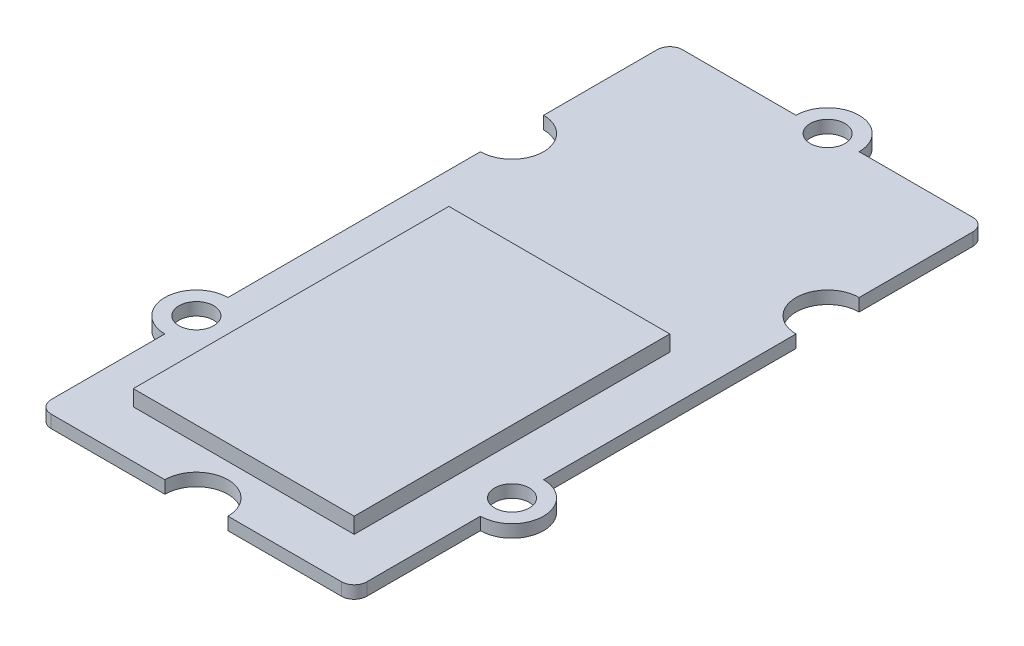
ISO-10303-21;
HEADER;
FILE_DESCRIPTION(('STEP AP214'),'2;1');
FILE_NAME('part.step','',(''),(''),'','','');
FILE_SCHEMA(('AUTOMOTIVE_DESIGN { 1 0 10303 214 1 1 1 1 }'));
ENDSEC;
DATA;
#1=APPLICATION_CONTEXT('core data for automotive mechanical design processes');
#2=APPLICATION_PROTOCOL_DEFINITION('international standard','automotive_design',2000,#1);
#3=PRODUCT_CONTEXT('',#1,'mechanical');
#4=PRODUCT('Part','Part','',(#3));
#5=PRODUCT_RELATED_PRODUCT_CATEGORY('part','',(#4));
#6=PRODUCT_DEFINITION_FORMATION('','',#4);
#7=PRODUCT_DEFINITION_CONTEXT('part definition',#1,'design');
#8=PRODUCT_DEFINITION('design','',#6,#7);
#9=PRODUCT_DEFINITION_SHAPE('','',#8);
#10=(LENGTH_UNIT() NAMED_UNIT(*) SI_UNIT(.MILLI.,.METRE.));
#11=(NAMED_UNIT(*) PLANE_ANGLE_UNIT() SI_UNIT($,.RADIAN.));
#12=(NAMED_UNIT(*) SI_UNIT($,.STERADIAN.) SOLID_ANGLE_UNIT());
#13=UNCERTAINTY_MEASURE_WITH_UNIT(LENGTH_MEASURE(1.E-05),#10,'distance_accuracy_value','');
#14=(GEOMETRIC_REPRESENTATION_CONTEXT(3) GLOBAL_UNCERTAINTY_ASSIGNED_CONTEXT((#13)) GLOBAL_UNIT_ASSIGNED_CONTEXT((#10,
#11,#12)) REPRESENTATION_CONTEXT('',''));
#15=CARTESIAN_POINT('',(0.,0.,0.));
#16=DIRECTION('',(0.,0.,1.));
#17=DIRECTION('',(1.,0.,0.));
#18=AXIS2_PLACEMENT_3D('',#15,#16,#17);
#19=CARTESIAN_POINT('',(0.8,0.8,-0.8));
#20=DIRECTION('',(0.,-1.,0.));
#21=DIRECTION('',(0.,0.,-1.));
#22=AXIS2_PLACEMENT_3D('',#19,#20,#21);
#23=PLANE('',#22);
#24=CARTESIAN_POINT('',(0.,0.8,-10.));
#25=DIRECTION('',(0.,1.,0.));
#26=DIRECTION('',(0.,0.,1.));
#27=AXIS2_PLACEMENT_3D('',#24,#25,#26);
#28=CIRCLE('',#27,1.1);
#29=CARTESIAN_POINT('',(0.,0.8,-8.9));
#30=VERTEX_POINT('',#29);
#31=EDGE_CURVE('E216',#30,#30,#28,.T.);
#32=ORIENTED_EDGE('',*,*,#31,.F.);
#33=EDGE_LOOP('',(#32));
#34=FACE_BOUND('',#33,.T.);
#35=CARTESIAN_POINT('',(20.,0.8,-10.));
#36=DIRECTION('',(0.,1.,0.));
#37=DIRECTION('',(0.,0.,1.));
#38=AXIS2_PLACEMENT_3D('',#35,#36,#37);
#39=CIRCLE('',#38,1.1);
#40=CARTESIAN_POINT('',(20.,0.8,-8.9));
#41=VERTEX_POINT('',#40);
#42=EDGE_CURVE('E225',#41,#41,#39,.T.);
#43=ORIENTED_EDGE('',*,*,#42,.F.);
#44=EDGE_LOOP('',(#43));
#45=FACE_BOUND('',#44,.T.);
#46=CARTESIAN_POINT('',(10.,0.8,-40.));
#47=DIRECTION('',(0.,1.,0.));
#48=DIRECTION('',(0.,0.,1.));
#49=AXIS2_PLACEMENT_3D('',#46,#47,#48);
#50=CIRCLE('',#49,1.1);
#51=CARTESIAN_POINT('',(10.,0.8,-38.9));
#52=VERTEX_POINT('',#51);
#53=EDGE_CURVE('E231',#52,#52,#50,.T.);
#54=ORIENTED_EDGE('',*,*,#53,.F.);
#55=EDGE_LOOP('',(#54));
#56=FACE_BOUND('',#55,.T.);
#57=CARTESIAN_POINT('',(0.8,0.8,-0.8));
#58=DIRECTION('',(0.,1.,0.));
#59=DIRECTION('',(0.,0.,-1.));
#60=AXIS2_PLACEMENT_3D('',#57,#58,#59);
#61=CIRCLE('',#60,0.8);
#62=CARTESIAN_POINT('',(0.,0.8,-0.800000000000006));
#63=VERTEX_POINT('',#62);
#64=CARTESIAN_POINT('',(0.800000000000006,0.8,0.));
#65=VERTEX_POINT('',#64);
#66=EDGE_CURVE('E237',#63,#65,#61,.T.);
#67=ORIENTED_EDGE('',*,*,#66,.T.);
#68=DIRECTION('',(1.,0.,0.));
#69=VECTOR('',#68,1.);
#70=CARTESIAN_POINT('',(0.800000000000006,0.8,0.));
#71=LINE('',#70,#69);
#72=CARTESIAN_POINT('',(8.,0.8,0.));
#73=VERTEX_POINT('',#72);
#74=EDGE_CURVE('E240',#65,#73,#71,.T.);
#75=ORIENTED_EDGE('',*,*,#74,.T.);
#76=CARTESIAN_POINT('',(10.,0.8,0.));
#77=DIRECTION('',(0.,-1.,0.));
#78=DIRECTION('',(0.,0.,1.));
#79=AXIS2_PLACEMENT_3D('',#76,#77,#78);
#80=CIRCLE('',#79,2.);
#81=CARTESIAN_POINT('',(12.,0.8,0.));
#82=VERTEX_POINT('',#81);
#83=EDGE_CURVE('E243',#73,#82,#80,.T.);
#84=ORIENTED_EDGE('',*,*,#83,.T.);
#85=DIRECTION('',(1.,0.,0.));
#86=VECTOR('',#85,1.);
#87=CARTESIAN_POINT('',(12.,0.8,0.));
#88=LINE('',#87,#86);
#89=CARTESIAN_POINT('',(19.2,0.8,0.));
#90=VERTEX_POINT('',#89);
#91=EDGE_CURVE('E245',#82,#90,#88,.T.);
#92=ORIENTED_EDGE('',*,*,#91,.T.);
#93=CARTESIAN_POINT('',(19.2,0.8,-0.8));
#94=DIRECTION('',(0.,1.,0.));
#95=DIRECTION('',(0.,0.,1.));
#96=AXIS2_PLACEMENT_3D('',#93,#94,#95);
#97=CIRCLE('',#96,0.799999999999999);
#98=CARTESIAN_POINT('',(20.,0.8,-0.800000000000006));
#99=VERTEX_POINT('',#98);
#100=EDGE_CURVE('E247',#90,#99,#97,.T.);
#101=ORIENTED_EDGE('',*,*,#100,.T.);
#102=DIRECTION('',(0.,0.,-1.));
#103=VECTOR('',#102,1.);
#104=CARTESIAN_POINT('',(20.,0.8,-0.800000000000006));
#105=LINE('',#104,#103);
#106=CARTESIAN_POINT('',(20.,0.8,-8.));
#107=VERTEX_POINT('',#106);
#108=EDGE_CURVE('E249',#99,#107,#105,.T.);
#109=ORIENTED_EDGE('',*,*,#108,.T.);
#110=CARTESIAN_POINT('',(20.,0.8,-10.));
#111=DIRECTION('',(0.,1.,0.));
#112=DIRECTION('',(0.,0.,1.));
#113=AXIS2_PLACEMENT_3D('',#110,#111,#112);
#114=CIRCLE('',#113,2.);
#115=CARTESIAN_POINT('',(20.,0.8,-12.));
#116=VERTEX_POINT('',#115);
#117=EDGE_CURVE('E251',#107,#116,#114,.T.);
#118=ORIENTED_EDGE('',*,*,#117,.T.);
#119=DIRECTION('',(0.,0.,-1.));
#120=VECTOR('',#119,1.);
#121=CARTESIAN_POINT('',(20.,0.8,-12.));
#122=LINE('',#121,#120);
#123=CARTESIAN_POINT('',(20.,0.8,-28.));
#124=VERTEX_POINT('',#123);
#125=EDGE_CURVE('E253',#116,#124,#122,.T.);
#126=ORIENTED_EDGE('',*,*,#125,.T.);
#127=CARTESIAN_POINT('',(20.,0.8,-30.));
#128=DIRECTION('',(0.,-1.,0.));
#129=DIRECTION('',(0.,0.,1.));
#130=AXIS2_PLACEMENT_3D('',#127,#128,#129);
#131=CIRCLE('',#130,2.);
#132=CARTESIAN_POINT('',(20.,0.8,-32.));
#133=VERTEX_POINT('',#132);
#134=EDGE_CURVE('E255',#124,#133,#131,.T.);
#135=ORIENTED_EDGE('',*,*,#134,.T.);
#136=DIRECTION('',(0.,0.,-1.));
#137=VECTOR('',#136,1.);
#138=CARTESIAN_POINT('',(20.,0.8,-32.));
#139=LINE('',#138,#137);
#140=CARTESIAN_POINT('',(20.,0.8,-39.2));
#141=VERTEX_POINT('',#140);
#142=EDGE_CURVE('E257',#133,#141,#139,.T.);
#143=ORIENTED_EDGE('',*,*,#142,.T.);
#144=CARTESIAN_POINT('',(19.2,0.8,-39.2));
#145=DIRECTION('',(0.,1.,0.));
#146=DIRECTION('',(0.,0.,-1.));
#147=AXIS2_PLACEMENT_3D('',#144,#145,#146);
#148=CIRCLE('',#147,0.8);
#149=CARTESIAN_POINT('',(19.2,0.8,-40.));
#150=VERTEX_POINT('',#149);
#151=EDGE_CURVE('E259',#141,#150,#148,.T.);
#152=ORIENTED_EDGE('',*,*,#151,.T.);
#153=DIRECTION('',(-1.,0.,0.));
#154=VECTOR('',#153,1.);
#155=CARTESIAN_POINT('',(12.,0.8,-40.));
#156=LINE('',#155,#154);
#157=CARTESIAN_POINT('',(12.,0.8,-40.));
#158=VERTEX_POINT('',#157);
#159=EDGE_CURVE('E261',#150,#158,#156,.T.);
#160=ORIENTED_EDGE('',*,*,#159,.T.);
#161=CARTESIAN_POINT('',(10.,0.8,-40.));
#162=DIRECTION('',(0.,1.,0.));
#163=DIRECTION('',(0.,0.,1.));
#164=AXIS2_PLACEMENT_3D('',#161,#162,#163);
#165=CIRCLE('',#164,2.);
#166=CARTESIAN_POINT('',(8.,0.8,-40.));
#167=VERTEX_POINT('',#166);
#168=EDGE_CURVE('E263',#158,#167,#165,.T.);
#169=ORIENTED_EDGE('',*,*,#168,.T.);
#170=DIRECTION('',(-1.,0.,0.));
#171=VECTOR('',#170,1.);
#172=CARTESIAN_POINT('',(0.800000000000006,0.8,-40.));
#173=LINE('',#172,#171);
#174=CARTESIAN_POINT('',(0.800000000000006,0.8,-40.));
#175=VERTEX_POINT('',#174);
#176=EDGE_CURVE('E265',#167,#175,#173,.T.);
#177=ORIENTED_EDGE('',*,*,#176,.T.);
#178=CARTESIAN_POINT('',(0.8,0.8,-39.2));
#179=DIRECTION('',(0.,1.,0.));
#180=DIRECTION('',(0.,0.,-1.));
#181=AXIS2_PLACEMENT_3D('',#178,#179,#180);
#182=CIRCLE('',#181,0.800000000000001);
#183=CARTESIAN_POINT('',(0.,0.8,-39.2));
#184=VERTEX_POINT('',#183);
#185=EDGE_CURVE('E267',#175,#184,#182,.T.);
#186=ORIENTED_EDGE('',*,*,#185,.T.);
#187=DIRECTION('',(0.,0.,1.));
#188=VECTOR('',#187,1.);
#189=CARTESIAN_POINT('',(0.,0.8,-32.));
#190=LINE('',#189,#188);
#191=CARTESIAN_POINT('',(0.,0.8,-32.));
#192=VERTEX_POINT('',#191);
#193=EDGE_CURVE('E269',#184,#192,#190,.T.);
#194=ORIENTED_EDGE('',*,*,#193,.T.);
#195=CARTESIAN_POINT('',(0.,0.8,-30.));
#196=DIRECTION('',(0.,-1.,0.));
#197=DIRECTION('',(0.,0.,1.));
#198=AXIS2_PLACEMENT_3D('',#195,#196,#197);
#199=CIRCLE('',#198,2.);
#200=CARTESIAN_POINT('',(0.,0.8,-28.));
#201=VERTEX_POINT('',#200);
#202=EDGE_CURVE('E271',#192,#201,#199,.T.);
#203=ORIENTED_EDGE('',*,*,#202,.T.);
#204=DIRECTION('',(0.,0.,1.));
#205=VECTOR('',#204,1.);
#206=CARTESIAN_POINT('',(0.,0.8,-12.));
#207=LINE('',#206,#205);
#208=CARTESIAN_POINT('',(0.,0.8,-12.));
#209=VERTEX_POINT('',#208);
#210=EDGE_CURVE('E273',#201,#209,#207,.T.);
#211=ORIENTED_EDGE('',*,*,#210,.T.);
#212=CARTESIAN_POINT('',(0.,0.8,-10.));
#213=DIRECTION('',(0.,1.,0.));
#214=DIRECTION('',(0.,0.,1.));
#215=AXIS2_PLACEMENT_3D('',#212,#213,#214);
#216=CIRCLE('',#215,2.);
#217=CARTESIAN_POINT('',(0.,0.8,-8.));
#218=VERTEX_POINT('',#217);
#219=EDGE_CURVE('E275',#209,#218,#216,.T.);
#220=ORIENTED_EDGE('',*,*,#219,.T.);
#221=DIRECTION('',(0.,0.,1.));
#222=VECTOR('',#221,1.);
#223=CARTESIAN_POINT('',(0.,0.8,-0.800000000000006));
#224=LINE('',#223,#222);
#225=EDGE_CURVE('E277',#218,#63,#224,.T.);
#226=ORIENTED_EDGE('',*,*,#225,.T.);
#227=EDGE_LOOP('',(#67,#75,#84,#92,#101,#109,#118,#126,#135,#143,#152,#160,#169,#177,#186,#194,
#203,#211,#220,#226));
#228=FACE_BOUND('',#227,.T.);
#229=DIRECTION('',(0.,0.,1.));
#230=VECTOR('',#229,1.);
#231=CARTESIAN_POINT('',(3.,0.8,-23.));
#232=LINE('',#231,#230);
#233=CARTESIAN_POINT('',(3.,0.8,-23.));
#234=VERTEX_POINT('',#233);
#235=CARTESIAN_POINT('',(3.,0.8,-3.));
#236=VERTEX_POINT('',#235);
#237=EDGE_CURVE('E47',#234,#236,#232,.T.);
#238=ORIENTED_EDGE('',*,*,#237,.F.);
#239=DIRECTION('',(-1.,0.,0.));
#240=VECTOR('',#239,1.);
#241=CARTESIAN_POINT('',(3.,0.8,-23.));
#242=LINE('',#241,#240);
#243=CARTESIAN_POINT('',(17.,0.8,-23.));
#244=VERTEX_POINT('',#243);
#245=EDGE_CURVE('E51',#244,#234,#242,.T.);
#246=ORIENTED_EDGE('',*,*,#245,.F.);
#247=DIRECTION('',(0.,0.,-1.));
#248=VECTOR('',#247,1.);
#249=CARTESIAN_POINT('',(17.,0.8,-23.));
#250=LINE('',#249,#248);
#251=CARTESIAN_POINT('',(17.,0.8,-3.));
#252=VERTEX_POINT('',#251);
#253=EDGE_CURVE('E728',#252,#244,#250,.T.);
#254=ORIENTED_EDGE('',*,*,#253,.F.);
#255=DIRECTION('',(1.,0.,0.));
#256=VECTOR('',#255,1.);
#257=CARTESIAN_POINT('',(3.,0.8,-3.));
#258=LINE('',#257,#256);
#259=EDGE_CURVE('E734',#236,#252,#258,.T.);
#260=ORIENTED_EDGE('',*,*,#259,.F.);
#261=EDGE_LOOP('',(#238,#246,#254,#260));
#262=FACE_BOUND('',#261,.T.);
#263=ADVANCED_FACE('F32',(#34,#45,#56,#228,#262),#23,.F.);
#264=CARTESIAN_POINT('',(0.8,0.,-0.8));
#265=DIRECTION('',(0.,-1.,0.));
#266=DIRECTION('',(0.,0.,-1.));
#267=AXIS2_PLACEMENT_3D('',#264,#265,#266);
#268=PLANE('',#267);
#269=CARTESIAN_POINT('',(20.,0.,-10.));
#270=DIRECTION('',(0.,1.,0.));
#271=DIRECTION('',(0.,0.,1.));
#272=AXIS2_PLACEMENT_3D('',#269,#270,#271);
#273=CIRCLE('',#272,1.1);
#274=CARTESIAN_POINT('',(20.,0.,-8.9));
#275=VERTEX_POINT('',#274);
#276=EDGE_CURVE('E223',#275,#275,#273,.T.);
#277=ORIENTED_EDGE('',*,*,#276,.T.);
#278=EDGE_LOOP('',(#277));
#279=FACE_BOUND('',#278,.T.);
#280=CARTESIAN_POINT('',(0.8,0.,-0.8));
#281=DIRECTION('',(0.,1.,0.));
#282=DIRECTION('',(0.,0.,-1.));
#283=AXIS2_PLACEMENT_3D('',#280,#281,#282);
#284=CIRCLE('',#283,0.8);
#285=CARTESIAN_POINT('',(0.,0.,-0.800000000000006));
#286=VERTEX_POINT('',#285);
#287=CARTESIAN_POINT('',(0.800000000000006,0.,0.));
#288=VERTEX_POINT('',#287);
#289=EDGE_CURVE('E234',#286,#288,#284,.T.);
#290=ORIENTED_EDGE('',*,*,#289,.F.);
#291=DIRECTION('',(0.,0.,1.));
#292=VECTOR('',#291,1.);
#293=CARTESIAN_POINT('',(0.,0.,-0.800000000000006));
#294=LINE('',#293,#292);
#295=CARTESIAN_POINT('',(0.,0.,-8.));
#296=VERTEX_POINT('',#295);
#297=EDGE_CURVE('E241',#296,#286,#294,.T.);
#298=ORIENTED_EDGE('',*,*,#297,.F.);
#299=CARTESIAN_POINT('',(0.,0.,-10.));
#300=DIRECTION('',(0.,1.,0.));
#301=DIRECTION('',(0.,0.,1.));
#302=AXIS2_PLACEMENT_3D('',#299,#300,#301);
#303=CIRCLE('',#302,2.);
#304=CARTESIAN_POINT('',(0.,0.,-12.));
#305=VERTEX_POINT('',#304);
#306=EDGE_CURVE('E316',#305,#296,#303,.T.);
#307=ORIENTED_EDGE('',*,*,#306,.F.);
#308=DIRECTION('',(0.,0.,1.));
#309=VECTOR('',#308,1.);
#310=CARTESIAN_POINT('',(0.,0.,-12.));
#311=LINE('',#310,#309);
#312=CARTESIAN_POINT('',(0.,0.,-28.));
#313=VERTEX_POINT('',#312);
#314=EDGE_CURVE('E314',#313,#305,#311,.T.);
#315=ORIENTED_EDGE('',*,*,#314,.F.);
#316=CARTESIAN_POINT('',(0.,0.,-30.));
#317=DIRECTION('',(0.,-1.,0.));
#318=DIRECTION('',(0.,0.,1.));
#319=AXIS2_PLACEMENT_3D('',#316,#317,#318);
#320=CIRCLE('',#319,2.);
#321=CARTESIAN_POINT('',(0.,0.,-32.));
#322=VERTEX_POINT('',#321);
#323=EDGE_CURVE('E312',#322,#313,#320,.T.);
#324=ORIENTED_EDGE('',*,*,#323,.F.);
#325=DIRECTION('',(0.,0.,1.));
#326=VECTOR('',#325,1.);
#327=CARTESIAN_POINT('',(0.,0.,-32.));
#328=LINE('',#327,#326);
#329=CARTESIAN_POINT('',(0.,0.,-39.2));
#330=VERTEX_POINT('',#329);
#331=EDGE_CURVE('E310',#330,#322,#328,.T.);
#332=ORIENTED_EDGE('',*,*,#331,.F.);
#333=CARTESIAN_POINT('',(0.8,0.,-39.2));
#334=DIRECTION('',(0.,1.,0.));
#335=DIRECTION('',(0.,0.,-1.));
#336=AXIS2_PLACEMENT_3D('',#333,#334,#335);
#337=CIRCLE('',#336,0.800000000000001);
#338=CARTESIAN_POINT('',(0.800000000000006,0.,-40.));
#339=VERTEX_POINT('',#338);
#340=EDGE_CURVE('E308',#339,#330,#337,.T.);
#341=ORIENTED_EDGE('',*,*,#340,.F.);
#342=DIRECTION('',(-1.,0.,0.));
#343=VECTOR('',#342,1.);
#344=CARTESIAN_POINT('',(0.800000000000006,0.,-40.));
#345=LINE('',#344,#343);
#346=CARTESIAN_POINT('',(8.,0.,-40.));
#347=VERTEX_POINT('',#346);
#348=EDGE_CURVE('E306',#347,#339,#345,.T.);
#349=ORIENTED_EDGE('',*,*,#348,.F.);
#350=CARTESIAN_POINT('',(10.,0.,-40.));
#351=DIRECTION('',(0.,1.,0.));
#352=DIRECTION('',(0.,0.,1.));
#353=AXIS2_PLACEMENT_3D('',#350,#351,#352);
#354=CIRCLE('',#353,2.);
#355=CARTESIAN_POINT('',(12.,0.,-40.));
#356=VERTEX_POINT('',#355);
#357=EDGE_CURVE('E304',#356,#347,#354,.T.);
#358=ORIENTED_EDGE('',*,*,#357,.F.);
#359=DIRECTION('',(-1.,0.,0.));
#360=VECTOR('',#359,1.);
#361=CARTESIAN_POINT('',(12.,0.,-40.));
#362=LINE('',#361,#360);
#363=CARTESIAN_POINT('',(19.2,0.,-40.));
#364=VERTEX_POINT('',#363);
#365=EDGE_CURVE('E302',#364,#356,#362,.T.);
#366=ORIENTED_EDGE('',*,*,#365,.F.);
#367=CARTESIAN_POINT('',(19.2,0.,-39.2));
#368=DIRECTION('',(0.,1.,0.));
#369=DIRECTION('',(0.,0.,-1.));
#370=AXIS2_PLACEMENT_3D('',#367,#368,#369);
#371=CIRCLE('',#370,0.8);
#372=CARTESIAN_POINT('',(20.,0.,-39.2));
#373=VERTEX_POINT('',#372);
#374=EDGE_CURVE('E300',#373,#364,#371,.T.);
#375=ORIENTED_EDGE('',*,*,#374,.F.);
#376=DIRECTION('',(0.,0.,-1.));
#377=VECTOR('',#376,1.);
#378=CARTESIAN_POINT('',(20.,0.,-32.));
#379=LINE('',#378,#377);
#380=CARTESIAN_POINT('',(20.,0.,-32.));
#381=VERTEX_POINT('',#380);
#382=EDGE_CURVE('E298',#381,#373,#379,.T.);
#383=ORIENTED_EDGE('',*,*,#382,.F.);
#384=CARTESIAN_POINT('',(20.,0.,-30.));
#385=DIRECTION('',(0.,-1.,0.));
#386=DIRECTION('',(0.,0.,1.));
#387=AXIS2_PLACEMENT_3D('',#384,#385,#386);
#388=CIRCLE('',#387,2.);
#389=CARTESIAN_POINT('',(20.,0.,-28.));
#390=VERTEX_POINT('',#389);
#391=EDGE_CURVE('E296',#390,#381,#388,.T.);
#392=ORIENTED_EDGE('',*,*,#391,.F.);
#393=DIRECTION('',(0.,0.,-1.));
#394=VECTOR('',#393,1.);
#395=CARTESIAN_POINT('',(20.,0.,-12.));
#396=LINE('',#395,#394);
#397=CARTESIAN_POINT('',(20.,0.,-12.));
#398=VERTEX_POINT('',#397);
#399=EDGE_CURVE('E294',#398,#390,#396,.T.);
#400=ORIENTED_EDGE('',*,*,#399,.F.);
#401=CARTESIAN_POINT('',(20.,0.,-10.));
#402=DIRECTION('',(0.,1.,0.));
#403=DIRECTION('',(0.,0.,1.));
#404=AXIS2_PLACEMENT_3D('',#401,#402,#403);
#405=CIRCLE('',#404,2.);
#406=CARTESIAN_POINT('',(20.,0.,-8.));
#407=VERTEX_POINT('',#406);
#408=EDGE_CURVE('E292',#407,#398,#405,.T.);
#409=ORIENTED_EDGE('',*,*,#408,.F.);
#410=DIRECTION('',(0.,0.,-1.));
#411=VECTOR('',#410,1.);
#412=CARTESIAN_POINT('',(20.,0.,-0.800000000000006));
#413=LINE('',#412,#411);
#414=CARTESIAN_POINT('',(20.,0.,-0.800000000000006));
#415=VERTEX_POINT('',#414);
#416=EDGE_CURVE('E290',#415,#407,#413,.T.);
#417=ORIENTED_EDGE('',*,*,#416,.F.);
#418=CARTESIAN_POINT('',(19.2,0.,-0.8));
#419=DIRECTION('',(0.,1.,0.));
#420=DIRECTION('',(0.,0.,1.));
#421=AXIS2_PLACEMENT_3D('',#418,#419,#420);
#422=CIRCLE('',#421,0.799999999999999);
#423=CARTESIAN_POINT('',(19.2,0.,0.));
#424=VERTEX_POINT('',#423);
#425=EDGE_CURVE('E288',#424,#415,#422,.T.);
#426=ORIENTED_EDGE('',*,*,#425,.F.);
#427=DIRECTION('',(1.,0.,0.));
#428=VECTOR('',#427,1.);
#429=CARTESIAN_POINT('',(12.,0.,0.));
#430=LINE('',#429,#428);
#431=CARTESIAN_POINT('',(12.,0.,0.));
#432=VERTEX_POINT('',#431);
#433=EDGE_CURVE('E286',#432,#424,#430,.T.);
#434=ORIENTED_EDGE('',*,*,#433,.F.);
#435=CARTESIAN_POINT('',(10.,0.,0.));
#436=DIRECTION('',(0.,-1.,0.));
#437=DIRECTION('',(0.,0.,1.));
#438=AXIS2_PLACEMENT_3D('',#435,#436,#437);
#439=CIRCLE('',#438,2.);
#440=CARTESIAN_POINT('',(8.,0.,0.));
#441=VERTEX_POINT('',#440);
#442=EDGE_CURVE('E284',#441,#432,#439,.T.);
#443=ORIENTED_EDGE('',*,*,#442,.F.);
#444=DIRECTION('',(1.,0.,0.));
#445=VECTOR('',#444,1.);
#446=CARTESIAN_POINT('',(0.800000000000006,0.,0.));
#447=LINE('',#446,#445);
#448=EDGE_CURVE('E282',#288,#441,#447,.T.);
#449=ORIENTED_EDGE('',*,*,#448,.F.);
#450=EDGE_LOOP('',(#290,#298,#307,#315,#324,#332,#341,#349,#358,#366,#375,#383,#392,#400,#409,
#417,#426,#434,#443,#449));
#451=FACE_BOUND('',#450,.T.);
#452=CARTESIAN_POINT('',(10.,0.,-40.));
#453=DIRECTION('',(0.,1.,0.));
#454=DIRECTION('',(0.,0.,1.));
#455=AXIS2_PLACEMENT_3D('',#452,#453,#454);
#456=CIRCLE('',#455,1.1);
#457=CARTESIAN_POINT('',(10.,0.,-38.9));
#458=VERTEX_POINT('',#457);
#459=EDGE_CURVE('E228',#458,#458,#456,.T.);
#460=ORIENTED_EDGE('',*,*,#459,.T.);
#461=EDGE_LOOP('',(#460));
#462=FACE_BOUND('',#461,.T.);
#463=CARTESIAN_POINT('',(0.,0.,-10.));
#464=DIRECTION('',(0.,1.,0.));
#465=DIRECTION('',(0.,0.,1.));
#466=AXIS2_PLACEMENT_3D('',#463,#464,#465);
#467=CIRCLE('',#466,1.1);
#468=CARTESIAN_POINT('',(0.,0.,-8.9));
#469=VERTEX_POINT('',#468);
#470=EDGE_CURVE('E213',#469,#469,#467,.T.);
#471=ORIENTED_EDGE('',*,*,#470,.T.);
#472=EDGE_LOOP('',(#471));
#473=FACE_BOUND('',#472,.T.);
#474=ADVANCED_FACE('F382',(#279,#451,#462,#473),#268,.T.);
#475=CARTESIAN_POINT('',(0.8,0.8,-0.8));
#476=DIRECTION('',(0.,-1.,0.));
#477=DIRECTION('',(0.,0.,-1.));
#478=AXIS2_PLACEMENT_3D('',#475,#476,#477);
#479=CYLINDRICAL_SURFACE('',#478,0.8);
#480=ORIENTED_EDGE('',*,*,#289,.T.);
#481=DIRECTION('',(0.,-1.,0.));
#482=VECTOR('',#481,1.);
#483=CARTESIAN_POINT('',(0.800000000000006,0.8,0.));
#484=LINE('',#483,#482);
#485=EDGE_CURVE('E11',#65,#288,#484,.T.);
#486=ORIENTED_EDGE('',*,*,#485,.F.);
#487=ORIENTED_EDGE('',*,*,#66,.F.);
#488=DIRECTION('',(0.,-1.,0.));
#489=VECTOR('',#488,1.);
#490=CARTESIAN_POINT('',(0.,0.8,-0.800000000000006));
#491=LINE('',#490,#489);
#492=EDGE_CURVE('E279',#63,#286,#491,.T.);
#493=ORIENTED_EDGE('',*,*,#492,.T.);
#494=EDGE_LOOP('',(#480,#486,#487,#493));
#495=FACE_BOUND('',#494,.T.);
#496=ADVANCED_FACE('F34',(#495),#479,.T.);
#497=CARTESIAN_POINT('',(0.800000000000006,0.8,0.));
#498=DIRECTION('',(0.,0.,-1.));
#499=DIRECTION('',(-1.,0.,0.));
#500=AXIS2_PLACEMENT_3D('',#497,#498,#499);
#501=PLANE('',#500);
#502=ORIENTED_EDGE('',*,*,#448,.T.);
#503=DIRECTION('',(0.,-1.,0.));
#504=VECTOR('',#503,1.);
#505=CARTESIAN_POINT('',(8.,0.8,0.));
#506=LINE('',#505,#504);
#507=EDGE_CURVE('E40',#73,#441,#506,.T.);
#508=ORIENTED_EDGE('',*,*,#507,.F.);
#509=ORIENTED_EDGE('',*,*,#74,.F.);
#510=ORIENTED_EDGE('',*,*,#485,.T.);
#511=EDGE_LOOP('',(#502,#508,#509,#510));
#512=FACE_BOUND('',#511,.T.);
#513=ADVANCED_FACE('F399',(#512),#501,.F.);
#514=CARTESIAN_POINT('',(10.,0.8,0.));
#515=DIRECTION('',(0.,-1.,0.));
#516=DIRECTION('',(0.,0.,-1.));
#517=AXIS2_PLACEMENT_3D('',#514,#515,#516);
#518=CYLINDRICAL_SURFACE('',#517,2.);
#519=ORIENTED_EDGE('',*,*,#442,.T.);
#520=DIRECTION('',(0.,-1.,0.));
#521=VECTOR('',#520,1.);
#522=CARTESIAN_POINT('',(12.,0.8,0.));
#523=LINE('',#522,#521);
#524=EDGE_CURVE('E369',#82,#432,#523,.T.);
#525=ORIENTED_EDGE('',*,*,#524,.F.);
#526=ORIENTED_EDGE('',*,*,#83,.F.);
#527=ORIENTED_EDGE('',*,*,#507,.T.);
#528=EDGE_LOOP('',(#519,#525,#526,#527));
#529=FACE_BOUND('',#528,.T.);
#530=ADVANCED_FACE('F376',(#529),#518,.F.);
#531=CARTESIAN_POINT('',(12.,0.8,0.));
#532=DIRECTION('',(0.,0.,-1.));
#533=DIRECTION('',(-1.,0.,0.));
#534=AXIS2_PLACEMENT_3D('',#531,#532,#533);
#535=PLANE('',#534);
#536=ORIENTED_EDGE('',*,*,#433,.T.);
#537=DIRECTION('',(0.,-1.,0.));
#538=VECTOR('',#537,1.);
#539=CARTESIAN_POINT('',(19.2,0.8,0.));
#540=LINE('',#539,#538);
#541=EDGE_CURVE('E366',#90,#424,#540,.T.);
#542=ORIENTED_EDGE('',*,*,#541,.F.);
#543=ORIENTED_EDGE('',*,*,#91,.F.);
#544=ORIENTED_EDGE('',*,*,#524,.T.);
#545=EDGE_LOOP('',(#536,#542,#543,#544));
#546=FACE_BOUND('',#545,.T.);
#547=ADVANCED_FACE('F388',(#546),#535,.F.);
#548=CARTESIAN_POINT('',(19.2,0.8,-0.8));
#549=DIRECTION('',(0.,-1.,0.));
#550=DIRECTION('',(0.,0.,-1.));
#551=AXIS2_PLACEMENT_3D('',#548,#549,#550);
#552=CYLINDRICAL_SURFACE('',#551,0.799999999999999);
#553=ORIENTED_EDGE('',*,*,#425,.T.);
#554=DIRECTION('',(0.,-1.,0.));
#555=VECTOR('',#554,1.);
#556=CARTESIAN_POINT('',(20.,0.8,-0.800000000000006));
#557=LINE('',#556,#555);
#558=EDGE_CURVE('E363',#99,#415,#557,.T.);
#559=ORIENTED_EDGE('',*,*,#558,.F.);
#560=ORIENTED_EDGE('',*,*,#100,.F.);
#561=ORIENTED_EDGE('',*,*,#541,.T.);
#562=EDGE_LOOP('',(#553,#559,#560,#561));
#563=FACE_BOUND('',#562,.T.);
#564=ADVANCED_FACE('F392',(#563),#552,.T.);
#565=CARTESIAN_POINT('',(20.,0.8,-0.800000000000006));
#566=DIRECTION('',(-1.,0.,0.));
#567=DIRECTION('',(0.,0.,1.));
#568=AXIS2_PLACEMENT_3D('',#565,#566,#567);
#569=PLANE('',#568);
#570=ORIENTED_EDGE('',*,*,#416,.T.);
#571=DIRECTION('',(0.,-1.,0.));
#572=VECTOR('',#571,1.);
#573=CARTESIAN_POINT('',(20.,0.8,-8.));
#574=LINE('',#573,#572);
#575=EDGE_CURVE('E360',#107,#407,#574,.T.);
#576=ORIENTED_EDGE('',*,*,#575,.F.);
#577=ORIENTED_EDGE('',*,*,#108,.F.);
#578=ORIENTED_EDGE('',*,*,#558,.T.);
#579=EDGE_LOOP('',(#570,#576,#577,#578));
#580=FACE_BOUND('',#579,.T.);
#581=ADVANCED_FACE('F472',(#580),#569,.F.);
#582=CARTESIAN_POINT('',(20.,0.8,-10.));
#583=DIRECTION('',(0.,-1.,0.));
#584=DIRECTION('',(0.,0.,-1.));
#585=AXIS2_PLACEMENT_3D('',#582,#583,#584);
#586=CYLINDRICAL_SURFACE('',#585,2.);
#587=ORIENTED_EDGE('',*,*,#408,.T.);
#588=DIRECTION('',(0.,-1.,0.));
#589=VECTOR('',#588,1.);
#590=CARTESIAN_POINT('',(20.,0.8,-12.));
#591=LINE('',#590,#589);
#592=EDGE_CURVE('E357',#116,#398,#591,.T.);
#593=ORIENTED_EDGE('',*,*,#592,.F.);
#594=ORIENTED_EDGE('',*,*,#117,.F.);
#595=ORIENTED_EDGE('',*,*,#575,.T.);
#596=EDGE_LOOP('',(#587,#593,#594,#595));
#597=FACE_BOUND('',#596,.T.);
#598=ADVANCED_FACE('F470',(#597),#586,.T.);
#599=CARTESIAN_POINT('',(20.,0.8,-12.));
#600=DIRECTION('',(-1.,0.,0.));
#601=DIRECTION('',(0.,0.,1.));
#602=AXIS2_PLACEMENT_3D('',#599,#600,#601);
#603=PLANE('',#602);
#604=ORIENTED_EDGE('',*,*,#399,.T.);
#605=DIRECTION('',(0.,-1.,0.));
#606=VECTOR('',#605,1.);
#607=CARTESIAN_POINT('',(20.,0.8,-28.));
#608=LINE('',#607,#606);
#609=EDGE_CURVE('E354',#124,#390,#608,.T.);
#610=ORIENTED_EDGE('',*,*,#609,.F.);
#611=ORIENTED_EDGE('',*,*,#125,.F.);
#612=ORIENTED_EDGE('',*,*,#592,.T.);
#613=EDGE_LOOP('',(#604,#610,#611,#612));
#614=FACE_BOUND('',#613,.T.);
#615=ADVANCED_FACE('F465',(#614),#603,.F.);
#616=CARTESIAN_POINT('',(20.,0.8,-30.));
#617=DIRECTION('',(0.,-1.,0.));
#618=DIRECTION('',(0.,0.,-1.));
#619=AXIS2_PLACEMENT_3D('',#616,#617,#618);
#620=CYLINDRICAL_SURFACE('',#619,2.);
#621=ORIENTED_EDGE('',*,*,#391,.T.);
#622=DIRECTION('',(0.,-1.,0.));
#623=VECTOR('',#622,1.);
#624=CARTESIAN_POINT('',(20.,0.8,-32.));
#625=LINE('',#624,#623);
#626=EDGE_CURVE('E351',#133,#381,#625,.T.);
#627=ORIENTED_EDGE('',*,*,#626,.F.);
#628=ORIENTED_EDGE('',*,*,#134,.F.);
#629=ORIENTED_EDGE('',*,*,#609,.T.);
#630=EDGE_LOOP('',(#621,#627,#628,#629));
#631=FACE_BOUND('',#630,.T.);
#632=ADVANCED_FACE('F460',(#631),#620,.F.);
#633=CARTESIAN_POINT('',(20.,0.8,-32.));
#634=DIRECTION('',(-1.,0.,0.));
#635=DIRECTION('',(0.,0.,1.));
#636=AXIS2_PLACEMENT_3D('',#633,#634,#635);
#637=PLANE('',#636);
#638=ORIENTED_EDGE('',*,*,#382,.T.);
#639=DIRECTION('',(0.,-1.,0.));
#640=VECTOR('',#639,1.);
#641=CARTESIAN_POINT('',(20.,0.8,-39.2));
#642=LINE('',#641,#640);
#643=EDGE_CURVE('E348',#141,#373,#642,.T.);
#644=ORIENTED_EDGE('',*,*,#643,.F.);
#645=ORIENTED_EDGE('',*,*,#142,.F.);
#646=ORIENTED_EDGE('',*,*,#626,.T.);
#647=EDGE_LOOP('',(#638,#644,#645,#646));
#648=FACE_BOUND('',#647,.T.);
#649=ADVANCED_FACE('F456',(#648),#637,.F.);
#650=CARTESIAN_POINT('',(19.2,0.8,-39.2));
#651=DIRECTION('',(0.,-1.,0.));
#652=DIRECTION('',(0.,0.,-1.));
#653=AXIS2_PLACEMENT_3D('',#650,#651,#652);
#654=CYLINDRICAL_SURFACE('',#653,0.8);
#655=ORIENTED_EDGE('',*,*,#374,.T.);
#656=DIRECTION('',(0.,-1.,0.));
#657=VECTOR('',#656,1.);
#658=CARTESIAN_POINT('',(19.2,0.8,-40.));
#659=LINE('',#658,#657);
#660=EDGE_CURVE('E345',#150,#364,#659,.T.);
#661=ORIENTED_EDGE('',*,*,#660,.F.);
#662=ORIENTED_EDGE('',*,*,#151,.F.);
#663=ORIENTED_EDGE('',*,*,#643,.T.);
#664=EDGE_LOOP('',(#655,#661,#662,#663));
#665=FACE_BOUND('',#664,.T.);
#666=ADVANCED_FACE('F451',(#665),#654,.T.);
#667=CARTESIAN_POINT('',(12.,0.8,-40.));
#668=DIRECTION('',(0.,0.,1.));
#669=DIRECTION('',(1.,0.,0.));
#670=AXIS2_PLACEMENT_3D('',#667,#668,#669);
#671=PLANE('',#670);
#672=ORIENTED_EDGE('',*,*,#365,.T.);
#673=DIRECTION('',(0.,-1.,0.));
#674=VECTOR('',#673,1.);
#675=CARTESIAN_POINT('',(12.,0.8,-40.));
#676=LINE('',#675,#674);
#677=EDGE_CURVE('E342',#158,#356,#676,.T.);
#678=ORIENTED_EDGE('',*,*,#677,.F.);
#679=ORIENTED_EDGE('',*,*,#159,.F.);
#680=ORIENTED_EDGE('',*,*,#660,.T.);
#681=EDGE_LOOP('',(#672,#678,#679,#680));
#682=FACE_BOUND('',#681,.T.);
#683=ADVANCED_FACE('F445',(#682),#671,.F.);
#684=CARTESIAN_POINT('',(10.,0.8,-40.));
#685=DIRECTION('',(0.,-1.,0.));
#686=DIRECTION('',(0.,0.,-1.));
#687=AXIS2_PLACEMENT_3D('',#684,#685,#686);
#688=CYLINDRICAL_SURFACE('',#687,2.);
#689=ORIENTED_EDGE('',*,*,#357,.T.);
#690=DIRECTION('',(0.,-1.,0.));
#691=VECTOR('',#690,1.);
#692=CARTESIAN_POINT('',(8.,0.8,-40.));
#693=LINE('',#692,#691);
#694=EDGE_CURVE('E339',#167,#347,#693,.T.);
#695=ORIENTED_EDGE('',*,*,#694,.F.);
#696=ORIENTED_EDGE('',*,*,#168,.F.);
#697=ORIENTED_EDGE('',*,*,#677,.T.);
#698=EDGE_LOOP('',(#689,#695,#696,#697));
#699=FACE_BOUND('',#698,.T.);
#700=ADVANCED_FACE('F441',(#699),#688,.T.);
#701=CARTESIAN_POINT('',(0.800000000000006,0.8,-40.));
#702=DIRECTION('',(0.,0.,1.));
#703=DIRECTION('',(1.,0.,0.));
#704=AXIS2_PLACEMENT_3D('',#701,#702,#703);
#705=PLANE('',#704);
#706=ORIENTED_EDGE('',*,*,#348,.T.);
#707=DIRECTION('',(0.,-1.,0.));
#708=VECTOR('',#707,1.);
#709=CARTESIAN_POINT('',(0.800000000000006,0.8,-40.));
#710=LINE('',#709,#708);
#711=EDGE_CURVE('E336',#175,#339,#710,.T.);
#712=ORIENTED_EDGE('',*,*,#711,.F.);
#713=ORIENTED_EDGE('',*,*,#176,.F.);
#714=ORIENTED_EDGE('',*,*,#694,.T.);
#715=EDGE_LOOP('',(#706,#712,#713,#714));
#716=FACE_BOUND('',#715,.T.);
#717=ADVANCED_FACE('F436',(#716),#705,.F.);
#718=CARTESIAN_POINT('',(0.8,0.8,-39.2));
#719=DIRECTION('',(0.,-1.,0.));
#720=DIRECTION('',(0.,0.,-1.));
#721=AXIS2_PLACEMENT_3D('',#718,#719,#720);
#722=CYLINDRICAL_SURFACE('',#721,0.800000000000001);
#723=ORIENTED_EDGE('',*,*,#340,.T.);
#724=DIRECTION('',(0.,-1.,0.));
#725=VECTOR('',#724,1.);
#726=CARTESIAN_POINT('',(0.,0.8,-39.2));
#727=LINE('',#726,#725);
#728=EDGE_CURVE('E333',#184,#330,#727,.T.);
#729=ORIENTED_EDGE('',*,*,#728,.F.);
#730=ORIENTED_EDGE('',*,*,#185,.F.);
#731=ORIENTED_EDGE('',*,*,#711,.T.);
#732=EDGE_LOOP('',(#723,#729,#730,#731));
#733=FACE_BOUND('',#732,.T.);
#734=ADVANCED_FACE('F430',(#733),#722,.T.);
#735=CARTESIAN_POINT('',(0.,0.8,-32.));
#736=DIRECTION('',(1.,0.,0.));
#737=DIRECTION('',(0.,0.,-1.));
#738=AXIS2_PLACEMENT_3D('',#735,#736,#737);
#739=PLANE('',#738);
#740=ORIENTED_EDGE('',*,*,#331,.T.);
#741=DIRECTION('',(0.,-1.,0.));
#742=VECTOR('',#741,1.);
#743=CARTESIAN_POINT('',(0.,0.8,-32.));
#744=LINE('',#743,#742);
#745=EDGE_CURVE('E330',#192,#322,#744,.T.);
#746=ORIENTED_EDGE('',*,*,#745,.F.);
#747=ORIENTED_EDGE('',*,*,#193,.F.);
#748=ORIENTED_EDGE('',*,*,#728,.T.);
#749=EDGE_LOOP('',(#740,#746,#747,#748));
#750=FACE_BOUND('',#749,.T.);
#751=ADVANCED_FACE('F426',(#750),#739,.F.);
#752=CARTESIAN_POINT('',(0.,0.8,-30.));
#753=DIRECTION('',(0.,-1.,0.));
#754=DIRECTION('',(0.,0.,-1.));
#755=AXIS2_PLACEMENT_3D('',#752,#753,#754);
#756=CYLINDRICAL_SURFACE('',#755,2.);
#757=ORIENTED_EDGE('',*,*,#323,.T.);
#758=DIRECTION('',(0.,-1.,0.));
#759=VECTOR('',#758,1.);
#760=CARTESIAN_POINT('',(0.,0.8,-28.));
#761=LINE('',#760,#759);
#762=EDGE_CURVE('E327',#201,#313,#761,.T.);
#763=ORIENTED_EDGE('',*,*,#762,.F.);
#764=ORIENTED_EDGE('',*,*,#202,.F.);
#765=ORIENTED_EDGE('',*,*,#745,.T.);
#766=EDGE_LOOP('',(#757,#763,#764,#765));
#767=FACE_BOUND('',#766,.T.);
#768=ADVANCED_FACE('F421',(#767),#756,.F.);
#769=CARTESIAN_POINT('',(0.,0.8,-12.));
#770=DIRECTION('',(1.,0.,0.));
#771=DIRECTION('',(0.,0.,-1.));
#772=AXIS2_PLACEMENT_3D('',#769,#770,#771);
#773=PLANE('',#772);
#774=ORIENTED_EDGE('',*,*,#314,.T.);
#775=DIRECTION('',(0.,-1.,0.));
#776=VECTOR('',#775,1.);
#777=CARTESIAN_POINT('',(0.,0.8,-12.));
#778=LINE('',#777,#776);
#779=EDGE_CURVE('E324',#209,#305,#778,.T.);
#780=ORIENTED_EDGE('',*,*,#779,.F.);
#781=ORIENTED_EDGE('',*,*,#210,.F.);
#782=ORIENTED_EDGE('',*,*,#762,.T.);
#783=EDGE_LOOP('',(#774,#780,#781,#782));
#784=FACE_BOUND('',#783,.T.);
#785=ADVANCED_FACE('F415',(#784),#773,.F.);
#786=CARTESIAN_POINT('',(0.,0.8,-10.));
#787=DIRECTION('',(0.,-1.,0.));
#788=DIRECTION('',(0.,0.,-1.));
#789=AXIS2_PLACEMENT_3D('',#786,#787,#788);
#790=CYLINDRICAL_SURFACE('',#789,2.);
#791=ORIENTED_EDGE('',*,*,#306,.T.);
#792=DIRECTION('',(0.,-1.,0.));
#793=VECTOR('',#792,1.);
#794=CARTESIAN_POINT('',(0.,0.8,-8.));
#795=LINE('',#794,#793);
#796=EDGE_CURVE('E321',#218,#296,#795,.T.);
#797=ORIENTED_EDGE('',*,*,#796,.F.);
#798=ORIENTED_EDGE('',*,*,#219,.F.);
#799=ORIENTED_EDGE('',*,*,#779,.T.);
#800=EDGE_LOOP('',(#791,#797,#798,#799));
#801=FACE_BOUND('',#800,.T.);
#802=ADVANCED_FACE('F411',(#801),#790,.T.);
#803=CARTESIAN_POINT('',(0.,0.8,-0.800000000000006));
#804=DIRECTION('',(1.,0.,0.));
#805=DIRECTION('',(0.,0.,-1.));
#806=AXIS2_PLACEMENT_3D('',#803,#804,#805);
#807=PLANE('',#806);
#808=ORIENTED_EDGE('',*,*,#297,.T.);
#809=ORIENTED_EDGE('',*,*,#492,.F.);
#810=ORIENTED_EDGE('',*,*,#225,.F.);
#811=ORIENTED_EDGE('',*,*,#796,.T.);
#812=EDGE_LOOP('',(#808,#809,#810,#811));
#813=FACE_BOUND('',#812,.T.);
#814=ADVANCED_FACE('F406',(#813),#807,.F.);
#815=CARTESIAN_POINT('',(10.,0.8,-40.));
#816=DIRECTION('',(0.,-1.,0.));
#817=DIRECTION('',(0.,0.,-1.));
#818=AXIS2_PLACEMENT_3D('',#815,#816,#817);
#819=CYLINDRICAL_SURFACE('',#818,1.1);
#820=ORIENTED_EDGE('',*,*,#53,.T.);
#821=EDGE_LOOP('',(#820));
#822=FACE_BOUND('',#821,.T.);
#823=ORIENTED_EDGE('',*,*,#459,.F.);
#824=EDGE_LOOP('',(#823));
#825=FACE_BOUND('',#824,.T.);
#826=ADVANCED_FACE('F492',(#822,#825),#819,.F.);
#827=CARTESIAN_POINT('',(20.,0.8,-10.));
#828=DIRECTION('',(0.,-1.,0.));
#829=DIRECTION('',(0.,0.,-1.));
#830=AXIS2_PLACEMENT_3D('',#827,#828,#829);
#831=CYLINDRICAL_SURFACE('',#830,1.1);
#832=ORIENTED_EDGE('',*,*,#42,.T.);
#833=EDGE_LOOP('',(#832));
#834=FACE_BOUND('',#833,.T.);
#835=ORIENTED_EDGE('',*,*,#276,.F.);
#836=EDGE_LOOP('',(#835));
#837=FACE_BOUND('',#836,.T.);
#838=ADVANCED_FACE('F578',(#834,#837),#831,.F.);
#839=CARTESIAN_POINT('',(0.,0.8,-10.));
#840=DIRECTION('',(0.,-1.,0.));
#841=DIRECTION('',(0.,0.,-1.));
#842=AXIS2_PLACEMENT_3D('',#839,#840,#841);
#843=CYLINDRICAL_SURFACE('',#842,1.1);
#844=ORIENTED_EDGE('',*,*,#31,.T.);
#845=EDGE_LOOP('',(#844));
#846=FACE_BOUND('',#845,.T.);
#847=ORIENTED_EDGE('',*,*,#470,.F.);
#848=EDGE_LOOP('',(#847));
#849=FACE_BOUND('',#848,.T.);
#850=ADVANCED_FACE('F585',(#846,#849),#843,.F.);
#851=CARTESIAN_POINT('',(3.,1.8,-23.));
#852=DIRECTION('',(1.,0.,0.));
#853=DIRECTION('',(0.,0.,-1.));
#854=AXIS2_PLACEMENT_3D('',#851,#852,#853);
#855=PLANE('',#854);
#856=ORIENTED_EDGE('',*,*,#237,.T.);
#857=DIRECTION('',(0.,-1.,0.));
#858=VECTOR('',#857,1.);
#859=CARTESIAN_POINT('',(3.,1.8,-3.));
#860=LINE('',#859,#858);
#861=CARTESIAN_POINT('',(3.,1.8,-3.));
#862=VERTEX_POINT('',#861);
#863=EDGE_CURVE('E196',#862,#236,#860,.T.);
#864=ORIENTED_EDGE('',*,*,#863,.F.);
#865=DIRECTION('',(0.,0.,1.));
#866=VECTOR('',#865,1.);
#867=CARTESIAN_POINT('',(3.,1.8,-23.));
#868=LINE('',#867,#866);
#869=CARTESIAN_POINT('',(3.,1.8,-23.));
#870=VERTEX_POINT('',#869);
#871=EDGE_CURVE('E202',#870,#862,#868,.T.);
#872=ORIENTED_EDGE('',*,*,#871,.F.);
#873=DIRECTION('',(0.,-1.,0.));
#874=VECTOR('',#873,1.);
#875=CARTESIAN_POINT('',(3.,1.8,-23.));
#876=LINE('',#875,#874);
#877=EDGE_CURVE('E726',#870,#234,#876,.T.);
#878=ORIENTED_EDGE('',*,*,#877,.T.);
#879=EDGE_LOOP('',(#856,#864,#872,#878));
#880=FACE_BOUND('',#879,.T.);
#881=ADVANCED_FACE('F212',(#880),#855,.F.);
#882=CARTESIAN_POINT('',(3.,1.8,-3.));
#883=DIRECTION('',(0.,0.,-1.));
#884=DIRECTION('',(-1.,0.,0.));
#885=AXIS2_PLACEMENT_3D('',#882,#883,#884);
#886=PLANE('',#885);
#887=ORIENTED_EDGE('',*,*,#259,.T.);
#888=DIRECTION('',(0.,-1.,0.));
#889=VECTOR('',#888,1.);
#890=CARTESIAN_POINT('',(17.,1.8,-3.));
#891=LINE('',#890,#889);
#892=CARTESIAN_POINT('',(17.,1.8,-3.));
#893=VERTEX_POINT('',#892);
#894=EDGE_CURVE('E198',#893,#252,#891,.T.);
#895=ORIENTED_EDGE('',*,*,#894,.F.);
#896=DIRECTION('',(1.,0.,0.));
#897=VECTOR('',#896,1.);
#898=CARTESIAN_POINT('',(3.,1.8,-3.));
#899=LINE('',#898,#897);
#900=EDGE_CURVE('E191',#862,#893,#899,.T.);
#901=ORIENTED_EDGE('',*,*,#900,.F.);
#902=ORIENTED_EDGE('',*,*,#863,.T.);
#903=EDGE_LOOP('',(#887,#895,#901,#902));
#904=FACE_BOUND('',#903,.T.);
#905=ADVANCED_FACE('F194',(#904),#886,.F.);
#906=CARTESIAN_POINT('',(17.,1.8,-23.));
#907=DIRECTION('',(-1.,0.,0.));
#908=DIRECTION('',(0.,0.,1.));
#909=AXIS2_PLACEMENT_3D('',#906,#907,#908);
#910=PLANE('',#909);
#911=ORIENTED_EDGE('',*,*,#253,.T.);
#912=DIRECTION('',(0.,-1.,0.));
#913=VECTOR('',#912,1.);
#914=CARTESIAN_POINT('',(17.,1.8,-23.));
#915=LINE('',#914,#913);
#916=CARTESIAN_POINT('',(17.,1.8,-23.));
#917=VERTEX_POINT('',#916);
#918=EDGE_CURVE('E218',#917,#244,#915,.T.);
#919=ORIENTED_EDGE('',*,*,#918,.F.);
#920=DIRECTION('',(0.,0.,-1.));
#921=VECTOR('',#920,1.);
#922=CARTESIAN_POINT('',(17.,1.8,-23.));
#923=LINE('',#922,#921);
#924=EDGE_CURVE('E201',#893,#917,#923,.T.);
#925=ORIENTED_EDGE('',*,*,#924,.F.);
#926=ORIENTED_EDGE('',*,*,#894,.T.);
#927=EDGE_LOOP('',(#911,#919,#925,#926));
#928=FACE_BOUND('',#927,.T.);
#929=ADVANCED_FACE('F605',(#928),#910,.F.);
#930=CARTESIAN_POINT('',(3.,1.8,-23.));
#931=DIRECTION('',(0.,0.,1.));
#932=DIRECTION('',(1.,0.,0.));
#933=AXIS2_PLACEMENT_3D('',#930,#931,#932);
#934=PLANE('',#933);
#935=ORIENTED_EDGE('',*,*,#245,.T.);
#936=ORIENTED_EDGE('',*,*,#877,.F.);
#937=DIRECTION('',(-1.,0.,0.));
#938=VECTOR('',#937,1.);
#939=CARTESIAN_POINT('',(3.,1.8,-23.));
#940=LINE('',#939,#938);
#941=EDGE_CURVE('E207',#917,#870,#940,.T.);
#942=ORIENTED_EDGE('',*,*,#941,.F.);
#943=ORIENTED_EDGE('',*,*,#918,.T.);
#944=EDGE_LOOP('',(#935,#936,#942,#943));
#945=FACE_BOUND('',#944,.T.);
#946=ADVANCED_FACE('F612',(#945),#934,.F.);
#947=CARTESIAN_POINT('',(0.,1.8,0.));
#948=DIRECTION('',(0.,1.,0.));
#949=DIRECTION('',(0.,0.,1.));
#950=AXIS2_PLACEMENT_3D('',#947,#948,#949);
#951=PLANE('',#950);
#952=ORIENTED_EDGE('',*,*,#871,.T.);
#953=ORIENTED_EDGE('',*,*,#900,.T.);
#954=ORIENTED_EDGE('',*,*,#924,.T.);
#955=ORIENTED_EDGE('',*,*,#941,.T.);
#956=EDGE_LOOP('',(#952,#953,#954,#955));
#957=FACE_BOUND('',#956,.T.);
#958=ADVANCED_FACE('F205',(#957),#951,.T.);
#959=CLOSED_SHELL('',(#263,#474,#496,#513,#530,#547,#564,#581,#598,#615,#632,#649,#666,#683,
#700,#717,#734,#751,#768,#785,#802,#814,#826,#838,#850,#881,#905,#929,#946,#958));
#960=MANIFOLD_SOLID_BREP('B2',#959);
#961=ADVANCED_BREP_SHAPE_REPRESENTATION('',(#18,#960),#14);
#962=SHAPE_DEFINITION_REPRESENTATION(#9,#961);
ENDSEC;
END-ISO-10303-21;
